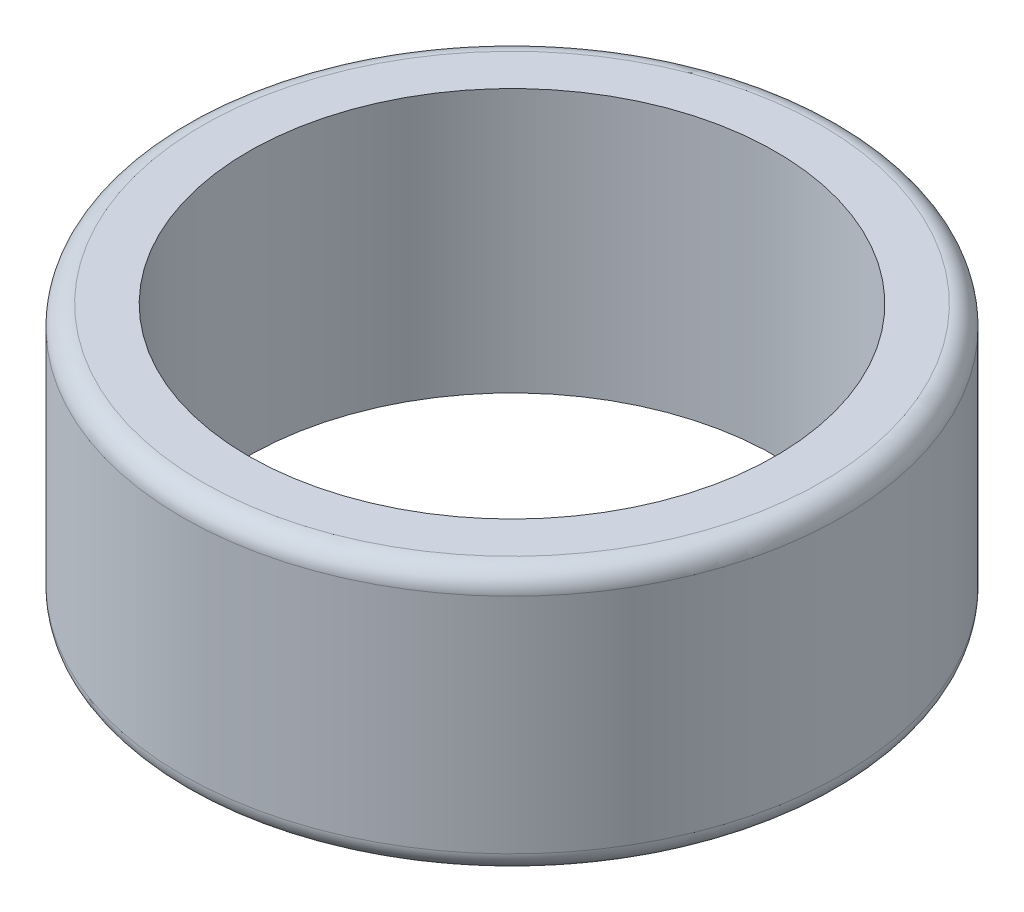
ISO-10303-21;
HEADER;
FILE_DESCRIPTION(('STEP AP214'),'2;1');
FILE_NAME('part.step','',(''),(''),'','','');
FILE_SCHEMA(('AUTOMOTIVE_DESIGN { 1 0 10303 214 1 1 1 1 }'));
ENDSEC;
DATA;
#1=APPLICATION_CONTEXT('core data for automotive mechanical design processes');
#2=APPLICATION_PROTOCOL_DEFINITION('international standard','automotive_design',2000,#1);
#3=PRODUCT_CONTEXT('',#1,'mechanical');
#4=PRODUCT('Part','Part','',(#3));
#5=PRODUCT_RELATED_PRODUCT_CATEGORY('part','',(#4));
#6=PRODUCT_DEFINITION_FORMATION('','',#4);
#7=PRODUCT_DEFINITION_CONTEXT('part definition',#1,'design');
#8=PRODUCT_DEFINITION('design','',#6,#7);
#9=PRODUCT_DEFINITION_SHAPE('','',#8);
#10=(LENGTH_UNIT() NAMED_UNIT(*) SI_UNIT(.MILLI.,.METRE.));
#11=(NAMED_UNIT(*) PLANE_ANGLE_UNIT() SI_UNIT($,.RADIAN.));
#12=(NAMED_UNIT(*) SI_UNIT($,.STERADIAN.) SOLID_ANGLE_UNIT());
#13=UNCERTAINTY_MEASURE_WITH_UNIT(LENGTH_MEASURE(1.E-05),#10,'distance_accuracy_value','');
#14=(GEOMETRIC_REPRESENTATION_CONTEXT(3) GLOBAL_UNCERTAINTY_ASSIGNED_CONTEXT((#13)) GLOBAL_UNIT_ASSIGNED_CONTEXT((#10,
#11,#12)) REPRESENTATION_CONTEXT('',''));
#15=CARTESIAN_POINT('',(0.,0.,0.));
#16=DIRECTION('',(0.,0.,1.));
#17=DIRECTION('',(1.,0.,0.));
#18=AXIS2_PLACEMENT_3D('',#15,#16,#17);
#19=CARTESIAN_POINT('',(0.,26.,0.));
#20=DIRECTION('',(0.,-1.,0.));
#21=DIRECTION('',(0.,0.,-1.));
#22=AXIS2_PLACEMENT_3D('',#19,#20,#21);
#23=CYLINDRICAL_SURFACE('',#22,32.5);
#24=CARTESIAN_POINT('',(0.,2.,0.));
#25=DIRECTION('',(0.,1.,0.));
#26=DIRECTION('',(0.,0.,1.));
#27=AXIS2_PLACEMENT_3D('',#24,#25,#26);
#28=CIRCLE('',#27,32.5);
#29=CARTESIAN_POINT('',(0.,1.99999999999999,-32.5));
#30=VERTEX_POINT('',#29);
#31=EDGE_CURVE('E44',#30,#30,#28,.T.);
#32=CARTESIAN_POINT('',(0.,24.,0.));
#33=DIRECTION('',(0.,1.,0.));
#34=DIRECTION('',(0.,0.,1.));
#35=AXIS2_PLACEMENT_3D('',#32,#33,#34);
#36=CIRCLE('',#35,32.5);
#37=CARTESIAN_POINT('',(0.,24.,-32.5));
#38=VERTEX_POINT('',#37);
#39=EDGE_CURVE('E48',#38,#38,#36,.F.);
#40=CARTESIAN_POINT('',(0.,1.99999999999999,-32.5));
#41=CARTESIAN_POINT('',(0.,2.22916666666666,-32.5));
#42=CARTESIAN_POINT('',(0.,2.45833333333333,-32.5));
#43=CARTESIAN_POINT('',(0.,2.91666666666666,-32.5));
#44=CARTESIAN_POINT('',(0.,3.14583333333333,-32.5));
#45=CARTESIAN_POINT('',(0.,3.60416666666666,-32.5));
#46=CARTESIAN_POINT('',(0.,3.83333333333333,-32.5));
#47=CARTESIAN_POINT('',(0.,4.29166666666666,-32.5));
#48=CARTESIAN_POINT('',(0.,4.52083333333333,-32.5));
#49=CARTESIAN_POINT('',(0.,4.97916666666666,-32.5));
#50=CARTESIAN_POINT('',(0.,5.20833333333333,-32.5));
#51=CARTESIAN_POINT('',(0.,5.66666666666666,-32.5));
#52=CARTESIAN_POINT('',(0.,5.89583333333333,-32.5));
#53=CARTESIAN_POINT('',(0.,6.35416666666666,-32.5));
#54=CARTESIAN_POINT('',(0.,6.58333333333333,-32.5));
#55=CARTESIAN_POINT('',(0.,7.04166666666666,-32.5));
#56=CARTESIAN_POINT('',(0.,7.27083333333333,-32.5));
#57=CARTESIAN_POINT('',(0.,7.72916666666666,-32.5));
#58=CARTESIAN_POINT('',(0.,7.95833333333333,-32.5));
#59=CARTESIAN_POINT('',(0.,8.41666666666666,-32.5));
#60=CARTESIAN_POINT('',(0.,8.64583333333333,-32.5));
#61=CARTESIAN_POINT('',(0.,9.10416666666666,-32.5));
#62=CARTESIAN_POINT('',(0.,9.33333333333333,-32.5));
#63=CARTESIAN_POINT('',(0.,9.79166666666666,-32.5));
#64=CARTESIAN_POINT('',(0.,10.0208333333333,-32.5));
#65=CARTESIAN_POINT('',(0.,10.4791666666667,-32.5));
#66=CARTESIAN_POINT('',(0.,10.7083333333333,-32.5));
#67=CARTESIAN_POINT('',(0.,11.1666666666667,-32.5));
#68=CARTESIAN_POINT('',(0.,11.3958333333333,-32.5));
#69=CARTESIAN_POINT('',(0.,11.8541666666667,-32.5));
#70=CARTESIAN_POINT('',(0.,12.0833333333333,-32.5));
#71=CARTESIAN_POINT('',(0.,12.5416666666667,-32.5));
#72=CARTESIAN_POINT('',(0.,12.7708333333333,-32.5));
#73=CARTESIAN_POINT('',(0.,13.2291666666667,-32.5));
#74=CARTESIAN_POINT('',(0.,13.4583333333333,-32.5));
#75=CARTESIAN_POINT('',(0.,13.9166666666667,-32.5));
#76=CARTESIAN_POINT('',(0.,14.1458333333333,-32.5));
#77=CARTESIAN_POINT('',(0.,14.6041666666667,-32.5));
#78=CARTESIAN_POINT('',(0.,14.8333333333333,-32.5));
#79=CARTESIAN_POINT('',(0.,15.2916666666667,-32.5));
#80=CARTESIAN_POINT('',(0.,15.5208333333333,-32.5));
#81=CARTESIAN_POINT('',(0.,15.9791666666667,-32.5));
#82=CARTESIAN_POINT('',(0.,16.2083333333333,-32.5));
#83=CARTESIAN_POINT('',(0.,16.6666666666667,-32.5));
#84=CARTESIAN_POINT('',(0.,16.8958333333333,-32.5));
#85=CARTESIAN_POINT('',(0.,17.3541666666667,-32.5));
#86=CARTESIAN_POINT('',(0.,17.5833333333333,-32.5));
#87=CARTESIAN_POINT('',(0.,18.0416666666667,-32.5));
#88=CARTESIAN_POINT('',(0.,18.2708333333333,-32.5));
#89=CARTESIAN_POINT('',(0.,18.7291666666667,-32.5));
#90=CARTESIAN_POINT('',(0.,18.9583333333333,-32.5));
#91=CARTESIAN_POINT('',(0.,19.4166666666667,-32.5));
#92=CARTESIAN_POINT('',(0.,19.6458333333333,-32.5));
#93=CARTESIAN_POINT('',(0.,20.1041666666667,-32.5));
#94=CARTESIAN_POINT('',(0.,20.3333333333333,-32.5));
#95=CARTESIAN_POINT('',(0.,20.7916666666667,-32.5));
#96=CARTESIAN_POINT('',(0.,21.0208333333333,-32.5));
#97=CARTESIAN_POINT('',(0.,21.4791666666667,-32.5));
#98=CARTESIAN_POINT('',(0.,21.7083333333333,-32.5));
#99=CARTESIAN_POINT('',(0.,22.1666666666667,-32.5));
#100=CARTESIAN_POINT('',(0.,22.3958333333333,-32.5));
#101=CARTESIAN_POINT('',(0.,22.8541666666667,-32.5));
#102=CARTESIAN_POINT('',(0.,23.0833333333333,-32.5));
#103=CARTESIAN_POINT('',(0.,23.5416666666667,-32.5));
#104=CARTESIAN_POINT('',(0.,23.7708333333333,-32.5));
#105=CARTESIAN_POINT('',(0.,24.,-32.5));
#106=B_SPLINE_CURVE_WITH_KNOTS('',3,(#40,#41,#42,#43,#44,#45,#46,#47,#48,#49,#50,#51,#52,#53,
#54,#55,#56,#57,#58,#59,#60,#61,#62,#63,#64,#65,#66,#67,#68,#69,#70,#71,#72,#73,#74,#75,#76,#77,
#78,#79,#80,#81,#82,#83,#84,#85,#86,#87,#88,#89,#90,#91,#92,#93,#94,#95,#96,#97,#98,#99,#100,
#101,#102,#103,#104,#105),.UNSPECIFIED.,.F.,.F.,(4,2,2,2,2,2,2,2,2,2,2,2,2,2,2,2,2,2,2,2,2,2,2,
2,2,2,2,2,2,2,2,2,4),(0.,0.687500000000001,1.375,2.0625,2.75,3.4375,4.125,4.8125,5.5,6.1875,
6.875,7.5625,8.25,8.9375,9.625,10.3125,11.,11.6875,12.375,13.0625,13.75,14.4375,15.125,15.8125,
16.5,17.1875,17.875,18.5625,19.25,19.9375,20.625,21.3125,22.),.UNSPECIFIED.);
#107=EDGE_CURVE('BSEAM33',#30,#38,#106,.T.);
#108=ORIENTED_EDGE('',*,*,#31,.T.);
#109=ORIENTED_EDGE('',*,*,#39,.T.);
#110=ORIENTED_EDGE('',*,*,#107,.T.);
#111=ORIENTED_EDGE('',*,*,#107,.F.);
#112=EDGE_LOOP('',(#108,#110,#109,#111));
#113=FACE_BOUND('',#112,.T.);
#114=ADVANCED_FACE('F33',(#113),#23,.T.);
#115=CARTESIAN_POINT('',(0.,26.,0.));
#116=DIRECTION('',(0.,1.,0.));
#117=DIRECTION('',(0.,0.,1.));
#118=AXIS2_PLACEMENT_3D('',#115,#116,#117);
#119=PLANE('',#118);
#120=CARTESIAN_POINT('',(0.,26.,0.));
#121=DIRECTION('',(0.,1.,0.));
#122=DIRECTION('',(0.,0.,1.));
#123=AXIS2_PLACEMENT_3D('',#120,#121,#122);
#124=CIRCLE('',#123,30.5);
#125=CARTESIAN_POINT('',(0.,26.,30.5));
#126=VERTEX_POINT('',#125);
#127=EDGE_CURVE('E10',#126,#126,#124,.T.);
#128=ORIENTED_EDGE('',*,*,#127,.T.);
#129=EDGE_LOOP('',(#128));
#130=FACE_BOUND('',#129,.T.);
#131=CARTESIAN_POINT('',(0.,26.,0.));
#132=DIRECTION('',(0.,1.,0.));
#133=DIRECTION('',(0.,0.,1.));
#134=AXIS2_PLACEMENT_3D('',#131,#132,#133);
#135=CIRCLE('',#134,26.);
#136=CARTESIAN_POINT('',(0.,26.,26.));
#137=VERTEX_POINT('',#136);
#138=EDGE_CURVE('E54',#137,#137,#135,.T.);
#139=ORIENTED_EDGE('',*,*,#138,.F.);
#140=EDGE_LOOP('',(#139));
#141=FACE_BOUND('',#140,.T.);
#142=ADVANCED_FACE('F69',(#130,#141),#119,.T.);
#143=CARTESIAN_POINT('',(0.,0.,0.));
#144=DIRECTION('',(0.,1.,0.));
#145=DIRECTION('',(0.,0.,1.));
#146=AXIS2_PLACEMENT_3D('',#143,#144,#145);
#147=PLANE('',#146);
#148=CARTESIAN_POINT('',(0.,0.,0.));
#149=DIRECTION('',(0.,1.,0.));
#150=DIRECTION('',(0.,0.,1.));
#151=AXIS2_PLACEMENT_3D('',#148,#149,#150);
#152=CIRCLE('',#151,30.5);
#153=CARTESIAN_POINT('',(0.,0.,30.5));
#154=VERTEX_POINT('',#153);
#155=EDGE_CURVE('E40',#154,#154,#152,.F.);
#156=ORIENTED_EDGE('',*,*,#155,.T.);
#157=EDGE_LOOP('',(#156));
#158=FACE_BOUND('',#157,.T.);
#159=CARTESIAN_POINT('',(0.,0.,0.));
#160=DIRECTION('',(0.,1.,0.));
#161=DIRECTION('',(0.,0.,1.));
#162=AXIS2_PLACEMENT_3D('',#159,#160,#161);
#163=CIRCLE('',#162,26.);
#164=CARTESIAN_POINT('',(0.,0.,26.));
#165=VERTEX_POINT('',#164);
#166=EDGE_CURVE('E53',#165,#165,#163,.T.);
#167=ORIENTED_EDGE('',*,*,#166,.T.);
#168=EDGE_LOOP('',(#167));
#169=FACE_BOUND('',#168,.T.);
#170=ADVANCED_FACE('F60',(#158,#169),#147,.F.);
#171=CARTESIAN_POINT('',(0.,0.,0.));
#172=DIRECTION('',(0.,1.,0.));
#173=DIRECTION('',(0.,0.,1.));
#174=AXIS2_PLACEMENT_3D('',#171,#172,#173);
#175=CYLINDRICAL_SURFACE('',#174,26.);
#176=CARTESIAN_POINT('',(0.,0.,26.));
#177=CARTESIAN_POINT('',(0.,0.270833333333333,26.));
#178=CARTESIAN_POINT('',(0.,0.541666666666667,26.));
#179=CARTESIAN_POINT('',(0.,1.08333333333333,26.));
#180=CARTESIAN_POINT('',(0.,1.35416666666667,26.));
#181=CARTESIAN_POINT('',(0.,1.89583333333333,26.));
#182=CARTESIAN_POINT('',(0.,2.16666666666667,26.));
#183=CARTESIAN_POINT('',(0.,2.70833333333333,26.));
#184=CARTESIAN_POINT('',(0.,2.97916666666667,26.));
#185=CARTESIAN_POINT('',(0.,3.52083333333333,26.));
#186=CARTESIAN_POINT('',(0.,3.79166666666667,26.));
#187=CARTESIAN_POINT('',(0.,4.33333333333333,26.));
#188=CARTESIAN_POINT('',(0.,4.60416666666667,26.));
#189=CARTESIAN_POINT('',(0.,5.14583333333333,26.));
#190=CARTESIAN_POINT('',(0.,5.41666666666667,26.));
#191=CARTESIAN_POINT('',(0.,5.95833333333333,26.));
#192=CARTESIAN_POINT('',(0.,6.22916666666667,26.));
#193=CARTESIAN_POINT('',(0.,6.77083333333333,26.));
#194=CARTESIAN_POINT('',(0.,7.04166666666667,26.));
#195=CARTESIAN_POINT('',(0.,7.58333333333333,26.));
#196=CARTESIAN_POINT('',(0.,7.85416666666667,26.));
#197=CARTESIAN_POINT('',(0.,8.39583333333333,26.));
#198=CARTESIAN_POINT('',(0.,8.66666666666667,26.));
#199=CARTESIAN_POINT('',(0.,9.20833333333333,26.));
#200=CARTESIAN_POINT('',(0.,9.47916666666667,26.));
#201=CARTESIAN_POINT('',(0.,10.0208333333333,26.));
#202=CARTESIAN_POINT('',(0.,10.2916666666667,26.));
#203=CARTESIAN_POINT('',(0.,10.8333333333333,26.));
#204=CARTESIAN_POINT('',(0.,11.1041666666667,26.));
#205=CARTESIAN_POINT('',(0.,11.6458333333333,26.));
#206=CARTESIAN_POINT('',(0.,11.9166666666667,26.));
#207=CARTESIAN_POINT('',(0.,12.4583333333333,26.));
#208=CARTESIAN_POINT('',(0.,12.7291666666667,26.));
#209=CARTESIAN_POINT('',(0.,13.2708333333333,26.));
#210=CARTESIAN_POINT('',(0.,13.5416666666667,26.));
#211=CARTESIAN_POINT('',(0.,14.0833333333333,26.));
#212=CARTESIAN_POINT('',(0.,14.3541666666667,26.));
#213=CARTESIAN_POINT('',(0.,14.8958333333333,26.));
#214=CARTESIAN_POINT('',(0.,15.1666666666667,26.));
#215=CARTESIAN_POINT('',(0.,15.7083333333333,26.));
#216=CARTESIAN_POINT('',(0.,15.9791666666667,26.));
#217=CARTESIAN_POINT('',(0.,16.5208333333333,26.));
#218=CARTESIAN_POINT('',(0.,16.7916666666667,26.));
#219=CARTESIAN_POINT('',(0.,17.3333333333333,26.));
#220=CARTESIAN_POINT('',(0.,17.6041666666667,26.));
#221=CARTESIAN_POINT('',(0.,18.1458333333333,26.));
#222=CARTESIAN_POINT('',(0.,18.4166666666667,26.));
#223=CARTESIAN_POINT('',(0.,18.9583333333333,26.));
#224=CARTESIAN_POINT('',(0.,19.2291666666667,26.));
#225=CARTESIAN_POINT('',(0.,19.7708333333333,26.));
#226=CARTESIAN_POINT('',(0.,20.0416666666667,26.));
#227=CARTESIAN_POINT('',(0.,20.5833333333333,26.));
#228=CARTESIAN_POINT('',(0.,20.8541666666667,26.));
#229=CARTESIAN_POINT('',(0.,21.3958333333333,26.));
#230=CARTESIAN_POINT('',(0.,21.6666666666667,26.));
#231=CARTESIAN_POINT('',(0.,22.2083333333333,26.));
#232=CARTESIAN_POINT('',(0.,22.4791666666667,26.));
#233=CARTESIAN_POINT('',(0.,23.0208333333333,26.));
#234=CARTESIAN_POINT('',(0.,23.2916666666667,26.));
#235=CARTESIAN_POINT('',(0.,23.8333333333333,26.));
#236=CARTESIAN_POINT('',(0.,24.1041666666667,26.));
#237=CARTESIAN_POINT('',(0.,24.6458333333333,26.));
#238=CARTESIAN_POINT('',(0.,24.9166666666667,26.));
#239=CARTESIAN_POINT('',(0.,25.4583333333333,26.));
#240=CARTESIAN_POINT('',(0.,25.7291666666667,26.));
#241=CARTESIAN_POINT('',(0.,26.,26.));
#242=B_SPLINE_CURVE_WITH_KNOTS('',3,(#176,#177,#178,#179,#180,#181,#182,#183,#184,#185,#186,
#187,#188,#189,#190,#191,#192,#193,#194,#195,#196,#197,#198,#199,#200,#201,#202,#203,#204,#205,
#206,#207,#208,#209,#210,#211,#212,#213,#214,#215,#216,#217,#218,#219,#220,#221,#222,#223,#224,
#225,#226,#227,#228,#229,#230,#231,#232,#233,#234,#235,#236,#237,#238,#239,#240,#241),
.UNSPECIFIED.,.F.,.F.,(4,2,2,2,2,2,2,2,2,2,2,2,2,2,2,2,2,2,2,2,2,2,2,2,2,2,2,2,2,2,2,2,4),(0.,
0.8125,1.625,2.4375,3.25,4.0625,4.875,5.6875,6.5,7.3125,8.125,8.9375,9.75,10.5625,11.375,
12.1875,13.,13.8125,14.625,15.4375,16.25,17.0625,17.875,18.6875,19.5,20.3125,21.125,21.9375,
22.75,23.5625,24.375,25.1875,26.),.UNSPECIFIED.);
#243=EDGE_CURVE('BSEAM62',#165,#137,#242,.T.);
#244=ORIENTED_EDGE('',*,*,#166,.F.);
#245=ORIENTED_EDGE('',*,*,#138,.T.);
#246=ORIENTED_EDGE('',*,*,#243,.T.);
#247=ORIENTED_EDGE('',*,*,#243,.F.);
#248=EDGE_LOOP('',(#244,#246,#245,#247));
#249=FACE_BOUND('',#248,.T.);
#250=ADVANCED_FACE('F62',(#249),#175,.F.);
#251=CARTESIAN_POINT('',(0.,2.,0.));
#252=DIRECTION('',(0.,1.,0.));
#253=DIRECTION('',(0.,0.,1.));
#254=AXIS2_PLACEMENT_3D('',#251,#252,#253);
#255=TOROIDAL_SURFACE('',#254,30.5,2.);
#256=ORIENTED_EDGE('',*,*,#155,.F.);
#257=EDGE_LOOP('',(#256));
#258=FACE_BOUND('',#257,.T.);
#259=ORIENTED_EDGE('',*,*,#31,.F.);
#260=EDGE_LOOP('',(#259));
#261=FACE_BOUND('',#260,.T.);
#262=ADVANCED_FACE('F65',(#258,#261),#255,.T.);
#263=CARTESIAN_POINT('',(0.,24.,0.));
#264=DIRECTION('',(0.,1.,0.));
#265=DIRECTION('',(0.,0.,1.));
#266=AXIS2_PLACEMENT_3D('',#263,#264,#265);
#267=TOROIDAL_SURFACE('',#266,30.5,2.);
#268=ORIENTED_EDGE('',*,*,#39,.F.);
#269=EDGE_LOOP('',(#268));
#270=FACE_BOUND('',#269,.T.);
#271=ORIENTED_EDGE('',*,*,#127,.F.);
#272=EDGE_LOOP('',(#271));
#273=FACE_BOUND('',#272,.T.);
#274=ADVANCED_FACE('F35',(#270,#273),#267,.T.);
#275=CLOSED_SHELL('',(#114,#142,#170,#250,#262,#274));
#276=MANIFOLD_SOLID_BREP('B2',#275);
#277=ADVANCED_BREP_SHAPE_REPRESENTATION('',(#18,#276),#14);
#278=SHAPE_DEFINITION_REPRESENTATION(#9,#277);
ENDSEC;
END-ISO-10303-21;
